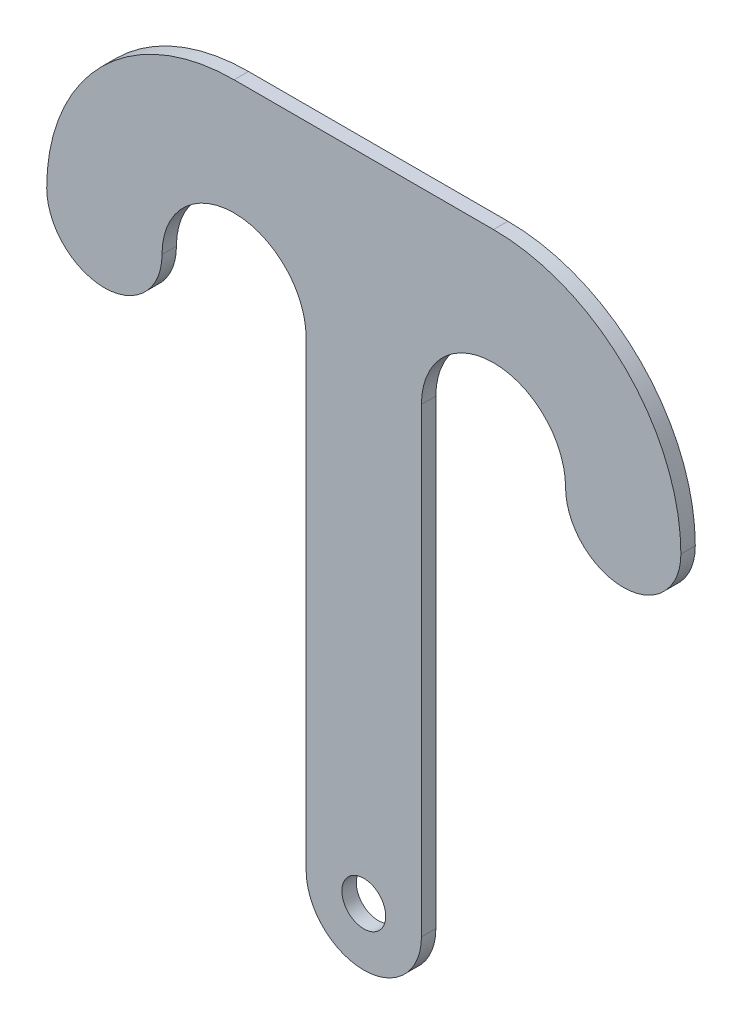
ISO-10303-21;
HEADER;
FILE_DESCRIPTION(('STEP AP214'),'2;1');
FILE_NAME('part.step','',(''),(''),'','','');
FILE_SCHEMA(('AUTOMOTIVE_DESIGN { 1 0 10303 214 1 1 1 1 }'));
ENDSEC;
DATA;
#1=APPLICATION_CONTEXT('core data for automotive mechanical design processes');
#2=APPLICATION_PROTOCOL_DEFINITION('international standard','automotive_design',2000,#1);
#3=PRODUCT_CONTEXT('',#1,'mechanical');
#4=PRODUCT('Part','Part','',(#3));
#5=PRODUCT_RELATED_PRODUCT_CATEGORY('part','',(#4));
#6=PRODUCT_DEFINITION_FORMATION('','',#4);
#7=PRODUCT_DEFINITION_CONTEXT('part definition',#1,'design');
#8=PRODUCT_DEFINITION('design','',#6,#7);
#9=PRODUCT_DEFINITION_SHAPE('','',#8);
#10=(LENGTH_UNIT() NAMED_UNIT(*) SI_UNIT(.MILLI.,.METRE.));
#11=(NAMED_UNIT(*) PLANE_ANGLE_UNIT() SI_UNIT($,.RADIAN.));
#12=(NAMED_UNIT(*) SI_UNIT($,.STERADIAN.) SOLID_ANGLE_UNIT());
#13=UNCERTAINTY_MEASURE_WITH_UNIT(LENGTH_MEASURE(1.E-05),#10,'distance_accuracy_value','');
#14=(GEOMETRIC_REPRESENTATION_CONTEXT(3) GLOBAL_UNCERTAINTY_ASSIGNED_CONTEXT((#13)) GLOBAL_UNIT_ASSIGNED_CONTEXT((#10,
#11,#12)) REPRESENTATION_CONTEXT('',''));
#15=CARTESIAN_POINT('',(0.,0.,0.));
#16=DIRECTION('',(0.,0.,1.));
#17=DIRECTION('',(1.,0.,0.));
#18=AXIS2_PLACEMENT_3D('',#15,#16,#17);
#19=CARTESIAN_POINT('',(0.,0.,3.175));
#20=DIRECTION('',(0.,0.,1.));
#21=DIRECTION('',(1.,0.,0.));
#22=AXIS2_PLACEMENT_3D('',#19,#20,#21);
#23=PLANE('',#22);
#24=CARTESIAN_POINT('',(0.,0.,3.175));
#25=DIRECTION('',(0.,0.,1.));
#26=DIRECTION('',(1.,0.,0.));
#27=AXIS2_PLACEMENT_3D('',#24,#25,#26);
#28=CIRCLE('',#27,12.7);
#29=CARTESIAN_POINT('',(-12.7,0.,3.175));
#30=VERTEX_POINT('',#29);
#31=CARTESIAN_POINT('',(12.7,0.,3.175));
#32=VERTEX_POINT('',#31);
#33=EDGE_CURVE('E165',#30,#32,#28,.T.);
#34=ORIENTED_EDGE('',*,*,#33,.T.);
#35=DIRECTION('',(0.,1.,0.));
#36=VECTOR('',#35,1.);
#37=CARTESIAN_POINT('',(12.7,0.,3.175));
#38=LINE('',#37,#36);
#39=CARTESIAN_POINT('',(12.7,101.6,3.175));
#40=VERTEX_POINT('',#39);
#41=EDGE_CURVE('E103',#32,#40,#38,.T.);
#42=ORIENTED_EDGE('',*,*,#41,.T.);
#43=CARTESIAN_POINT('',(28.575,101.6,3.175));
#44=DIRECTION('',(0.,0.,-1.));
#45=DIRECTION('',(-1.,0.,0.));
#46=AXIS2_PLACEMENT_3D('',#43,#44,#45);
#47=CIRCLE('',#46,15.875);
#48=CARTESIAN_POINT('',(44.45,101.6,3.175));
#49=VERTEX_POINT('',#48);
#50=EDGE_CURVE('E186',#40,#49,#47,.T.);
#51=ORIENTED_EDGE('',*,*,#50,.T.);
#52=CARTESIAN_POINT('',(57.15,101.6,3.175));
#53=DIRECTION('',(0.,0.,1.));
#54=DIRECTION('',(1.,0.,0.));
#55=AXIS2_PLACEMENT_3D('',#52,#53,#54);
#56=CIRCLE('',#55,12.7);
#57=CARTESIAN_POINT('',(69.85,101.6,3.175));
#58=VERTEX_POINT('',#57);
#59=EDGE_CURVE('E205',#49,#58,#56,.T.);
#60=ORIENTED_EDGE('',*,*,#59,.T.);
#61=CARTESIAN_POINT('',(28.575,101.6,3.175));
#62=DIRECTION('',(0.,0.,1.));
#63=DIRECTION('',(1.,0.,0.));
#64=AXIS2_PLACEMENT_3D('',#61,#62,#63);
#65=CIRCLE('',#64,41.275);
#66=CARTESIAN_POINT('',(28.575,142.875,3.175));
#67=VERTEX_POINT('',#66);
#68=EDGE_CURVE('E202',#58,#67,#65,.T.);
#69=ORIENTED_EDGE('',*,*,#68,.T.);
#70=DIRECTION('',(-1.,0.,0.));
#71=VECTOR('',#70,1.);
#72=CARTESIAN_POINT('',(28.575,142.875,3.175));
#73=LINE('',#72,#71);
#74=CARTESIAN_POINT('',(-28.575,142.875,3.175));
#75=VERTEX_POINT('',#74);
#76=EDGE_CURVE('E204',#67,#75,#73,.T.);
#77=ORIENTED_EDGE('',*,*,#76,.T.);
#78=CARTESIAN_POINT('',(-28.575,101.6,3.175));
#79=DIRECTION('',(0.,0.,1.));
#80=DIRECTION('',(-1.,0.,0.));
#81=AXIS2_PLACEMENT_3D('',#78,#79,#80);
#82=CIRCLE('',#81,41.275);
#83=CARTESIAN_POINT('',(-69.85,101.6,3.175));
#84=VERTEX_POINT('',#83);
#85=EDGE_CURVE('E128',#75,#84,#82,.T.);
#86=ORIENTED_EDGE('',*,*,#85,.T.);
#87=CARTESIAN_POINT('',(-57.15,101.6,3.175));
#88=DIRECTION('',(0.,0.,1.));
#89=DIRECTION('',(-1.,0.,0.));
#90=AXIS2_PLACEMENT_3D('',#87,#88,#89);
#91=CIRCLE('',#90,12.7);
#92=CARTESIAN_POINT('',(-44.45,101.6,3.175));
#93=VERTEX_POINT('',#92);
#94=EDGE_CURVE('E122',#84,#93,#91,.T.);
#95=ORIENTED_EDGE('',*,*,#94,.T.);
#96=CARTESIAN_POINT('',(-28.575,101.6,3.175));
#97=DIRECTION('',(0.,0.,-1.));
#98=DIRECTION('',(1.,0.,0.));
#99=AXIS2_PLACEMENT_3D('',#96,#97,#98);
#100=CIRCLE('',#99,15.875);
#101=CARTESIAN_POINT('',(-12.7,101.6,3.175));
#102=VERTEX_POINT('',#101);
#103=EDGE_CURVE('E126',#93,#102,#100,.T.);
#104=ORIENTED_EDGE('',*,*,#103,.T.);
#105=DIRECTION('',(0.,-1.,0.));
#106=VECTOR('',#105,1.);
#107=CARTESIAN_POINT('',(-12.7,0.,3.175));
#108=LINE('',#107,#106);
#109=EDGE_CURVE('E54',#102,#30,#108,.T.);
#110=ORIENTED_EDGE('',*,*,#109,.T.);
#111=EDGE_LOOP('',(#34,#42,#51,#60,#69,#77,#86,#95,#104,#110));
#112=FACE_BOUND('',#111,.T.);
#113=CARTESIAN_POINT('',(0.,0.,3.175));
#114=DIRECTION('',(0.,0.,1.));
#115=DIRECTION('',(1.,0.,0.));
#116=AXIS2_PLACEMENT_3D('',#113,#114,#115);
#117=CIRCLE('',#116,4.826);
#118=CARTESIAN_POINT('',(4.826,0.,3.175));
#119=VERTEX_POINT('',#118);
#120=EDGE_CURVE('E150',#119,#119,#117,.T.);
#121=ORIENTED_EDGE('',*,*,#120,.F.);
#122=EDGE_LOOP('',(#121));
#123=FACE_BOUND('',#122,.T.);
#124=ADVANCED_FACE('F37',(#112,#123),#23,.T.);
#125=CARTESIAN_POINT('',(0.,0.,0.));
#126=DIRECTION('',(0.,0.,1.));
#127=DIRECTION('',(1.,0.,0.));
#128=AXIS2_PLACEMENT_3D('',#125,#126,#127);
#129=PLANE('',#128);
#130=CARTESIAN_POINT('',(0.,0.,0.));
#131=DIRECTION('',(0.,0.,1.));
#132=DIRECTION('',(1.,0.,0.));
#133=AXIS2_PLACEMENT_3D('',#130,#131,#132);
#134=CIRCLE('',#133,12.7);
#135=CARTESIAN_POINT('',(-12.7,0.,0.));
#136=VERTEX_POINT('',#135);
#137=CARTESIAN_POINT('',(12.7,0.,0.));
#138=VERTEX_POINT('',#137);
#139=EDGE_CURVE('E146',#136,#138,#134,.T.);
#140=ORIENTED_EDGE('',*,*,#139,.F.);
#141=DIRECTION('',(0.,-1.,0.));
#142=VECTOR('',#141,1.);
#143=CARTESIAN_POINT('',(-12.7,0.,0.));
#144=LINE('',#143,#142);
#145=CARTESIAN_POINT('',(-12.7,101.6,0.));
#146=VERTEX_POINT('',#145);
#147=EDGE_CURVE('E95',#146,#136,#144,.T.);
#148=ORIENTED_EDGE('',*,*,#147,.F.);
#149=CARTESIAN_POINT('',(-28.575,101.6,0.));
#150=DIRECTION('',(0.,0.,-1.));
#151=DIRECTION('',(1.,0.,0.));
#152=AXIS2_PLACEMENT_3D('',#149,#150,#151);
#153=CIRCLE('',#152,15.875);
#154=CARTESIAN_POINT('',(-44.45,101.6,0.));
#155=VERTEX_POINT('',#154);
#156=EDGE_CURVE('E89',#155,#146,#153,.T.);
#157=ORIENTED_EDGE('',*,*,#156,.F.);
#158=CARTESIAN_POINT('',(-57.15,101.6,0.));
#159=DIRECTION('',(0.,0.,1.));
#160=DIRECTION('',(-1.,0.,0.));
#161=AXIS2_PLACEMENT_3D('',#158,#159,#160);
#162=CIRCLE('',#161,12.7);
#163=CARTESIAN_POINT('',(-69.85,101.6,0.));
#164=VERTEX_POINT('',#163);
#165=EDGE_CURVE('E136',#164,#155,#162,.T.);
#166=ORIENTED_EDGE('',*,*,#165,.F.);
#167=CARTESIAN_POINT('',(-28.575,101.6,0.));
#168=DIRECTION('',(0.,0.,1.));
#169=DIRECTION('',(-1.,0.,0.));
#170=AXIS2_PLACEMENT_3D('',#167,#168,#169);
#171=CIRCLE('',#170,41.275);
#172=CARTESIAN_POINT('',(-28.575,142.875,0.));
#173=VERTEX_POINT('',#172);
#174=EDGE_CURVE('E160',#173,#164,#171,.T.);
#175=ORIENTED_EDGE('',*,*,#174,.F.);
#176=DIRECTION('',(-1.,0.,0.));
#177=VECTOR('',#176,1.);
#178=CARTESIAN_POINT('',(28.575,142.875,0.));
#179=LINE('',#178,#177);
#180=CARTESIAN_POINT('',(28.575,142.875,0.));
#181=VERTEX_POINT('',#180);
#182=EDGE_CURVE('E158',#181,#173,#179,.T.);
#183=ORIENTED_EDGE('',*,*,#182,.F.);
#184=CARTESIAN_POINT('',(28.575,101.6,0.));
#185=DIRECTION('',(0.,0.,1.));
#186=DIRECTION('',(1.,0.,0.));
#187=AXIS2_PLACEMENT_3D('',#184,#185,#186);
#188=CIRCLE('',#187,41.275);
#189=CARTESIAN_POINT('',(69.85,101.6,0.));
#190=VERTEX_POINT('',#189);
#191=EDGE_CURVE('E156',#190,#181,#188,.T.);
#192=ORIENTED_EDGE('',*,*,#191,.F.);
#193=CARTESIAN_POINT('',(57.15,101.6,0.));
#194=DIRECTION('',(0.,0.,1.));
#195=DIRECTION('',(1.,0.,0.));
#196=AXIS2_PLACEMENT_3D('',#193,#194,#195);
#197=CIRCLE('',#196,12.7);
#198=CARTESIAN_POINT('',(44.45,101.6,0.));
#199=VERTEX_POINT('',#198);
#200=EDGE_CURVE('E154',#199,#190,#197,.T.);
#201=ORIENTED_EDGE('',*,*,#200,.F.);
#202=CARTESIAN_POINT('',(28.575,101.6,0.));
#203=DIRECTION('',(0.,0.,-1.));
#204=DIRECTION('',(-1.,0.,0.));
#205=AXIS2_PLACEMENT_3D('',#202,#203,#204);
#206=CIRCLE('',#205,15.875);
#207=CARTESIAN_POINT('',(12.7,101.6,0.));
#208=VERTEX_POINT('',#207);
#209=EDGE_CURVE('E152',#208,#199,#206,.T.);
#210=ORIENTED_EDGE('',*,*,#209,.F.);
#211=DIRECTION('',(0.,1.,0.));
#212=VECTOR('',#211,1.);
#213=CARTESIAN_POINT('',(12.7,0.,0.));
#214=LINE('',#213,#212);
#215=EDGE_CURVE('E149',#138,#208,#214,.T.);
#216=ORIENTED_EDGE('',*,*,#215,.F.);
#217=EDGE_LOOP('',(#140,#148,#157,#166,#175,#183,#192,#201,#210,#216));
#218=FACE_BOUND('',#217,.T.);
#219=CARTESIAN_POINT('',(0.,0.,0.));
#220=DIRECTION('',(0.,0.,1.));
#221=DIRECTION('',(1.,0.,0.));
#222=AXIS2_PLACEMENT_3D('',#219,#220,#221);
#223=CIRCLE('',#222,4.826);
#224=CARTESIAN_POINT('',(4.826,0.,0.));
#225=VERTEX_POINT('',#224);
#226=EDGE_CURVE('E213',#225,#225,#223,.T.);
#227=ORIENTED_EDGE('',*,*,#226,.T.);
#228=EDGE_LOOP('',(#227));
#229=FACE_BOUND('',#228,.T.);
#230=ADVANCED_FACE('F190',(#218,#229),#129,.F.);
#231=CARTESIAN_POINT('',(0.,0.,3.175));
#232=DIRECTION('',(0.,0.,-1.));
#233=DIRECTION('',(-1.,0.,0.));
#234=AXIS2_PLACEMENT_3D('',#231,#232,#233);
#235=CYLINDRICAL_SURFACE('',#234,12.7);
#236=ORIENTED_EDGE('',*,*,#139,.T.);
#237=DIRECTION('',(0.,0.,-1.));
#238=VECTOR('',#237,1.);
#239=CARTESIAN_POINT('',(12.7,0.,3.175));
#240=LINE('',#239,#238);
#241=EDGE_CURVE('E11',#32,#138,#240,.T.);
#242=ORIENTED_EDGE('',*,*,#241,.F.);
#243=ORIENTED_EDGE('',*,*,#33,.F.);
#244=DIRECTION('',(0.,0.,-1.));
#245=VECTOR('',#244,1.);
#246=CARTESIAN_POINT('',(-12.7,0.,3.175));
#247=LINE('',#246,#245);
#248=EDGE_CURVE('E142',#30,#136,#247,.T.);
#249=ORIENTED_EDGE('',*,*,#248,.T.);
#250=EDGE_LOOP('',(#236,#242,#243,#249));
#251=FACE_BOUND('',#250,.T.);
#252=ADVANCED_FACE('F39',(#251),#235,.T.);
#253=CARTESIAN_POINT('',(12.7,0.,3.175));
#254=DIRECTION('',(-1.,0.,0.));
#255=DIRECTION('',(0.,0.,1.));
#256=AXIS2_PLACEMENT_3D('',#253,#254,#255);
#257=PLANE('',#256);
#258=ORIENTED_EDGE('',*,*,#215,.T.);
#259=DIRECTION('',(0.,0.,-1.));
#260=VECTOR('',#259,1.);
#261=CARTESIAN_POINT('',(12.7,101.6,3.175));
#262=LINE('',#261,#260);
#263=EDGE_CURVE('E46',#40,#208,#262,.T.);
#264=ORIENTED_EDGE('',*,*,#263,.F.);
#265=ORIENTED_EDGE('',*,*,#41,.F.);
#266=ORIENTED_EDGE('',*,*,#241,.T.);
#267=EDGE_LOOP('',(#258,#264,#265,#266));
#268=FACE_BOUND('',#267,.T.);
#269=ADVANCED_FACE('F249',(#268),#257,.F.);
#270=CARTESIAN_POINT('',(28.575,101.6,3.175));
#271=DIRECTION('',(0.,0.,-1.));
#272=DIRECTION('',(-1.,0.,0.));
#273=AXIS2_PLACEMENT_3D('',#270,#271,#272);
#274=CYLINDRICAL_SURFACE('',#273,15.875);
#275=ORIENTED_EDGE('',*,*,#209,.T.);
#276=DIRECTION('',(0.,0.,-1.));
#277=VECTOR('',#276,1.);
#278=CARTESIAN_POINT('',(44.45,101.6,3.175));
#279=LINE('',#278,#277);
#280=EDGE_CURVE('E178',#49,#199,#279,.T.);
#281=ORIENTED_EDGE('',*,*,#280,.F.);
#282=ORIENTED_EDGE('',*,*,#50,.F.);
#283=ORIENTED_EDGE('',*,*,#263,.T.);
#284=EDGE_LOOP('',(#275,#281,#282,#283));
#285=FACE_BOUND('',#284,.T.);
#286=ADVANCED_FACE('F184',(#285),#274,.F.);
#287=CARTESIAN_POINT('',(57.15,101.6,3.175));
#288=DIRECTION('',(0.,0.,-1.));
#289=DIRECTION('',(-1.,0.,0.));
#290=AXIS2_PLACEMENT_3D('',#287,#288,#289);
#291=CYLINDRICAL_SURFACE('',#290,12.7);
#292=ORIENTED_EDGE('',*,*,#200,.T.);
#293=DIRECTION('',(0.,0.,-1.));
#294=VECTOR('',#293,1.);
#295=CARTESIAN_POINT('',(69.85,101.6,3.175));
#296=LINE('',#295,#294);
#297=EDGE_CURVE('E175',#58,#190,#296,.T.);
#298=ORIENTED_EDGE('',*,*,#297,.F.);
#299=ORIENTED_EDGE('',*,*,#59,.F.);
#300=ORIENTED_EDGE('',*,*,#280,.T.);
#301=EDGE_LOOP('',(#292,#298,#299,#300));
#302=FACE_BOUND('',#301,.T.);
#303=ADVANCED_FACE('F196',(#302),#291,.T.);
#304=CARTESIAN_POINT('',(28.575,101.6,3.175));
#305=DIRECTION('',(0.,0.,-1.));
#306=DIRECTION('',(-1.,0.,0.));
#307=AXIS2_PLACEMENT_3D('',#304,#305,#306);
#308=CYLINDRICAL_SURFACE('',#307,41.275);
#309=ORIENTED_EDGE('',*,*,#191,.T.);
#310=DIRECTION('',(0.,0.,-1.));
#311=VECTOR('',#310,1.);
#312=CARTESIAN_POINT('',(28.575,142.875,3.175));
#313=LINE('',#312,#311);
#314=EDGE_CURVE('E172',#67,#181,#313,.T.);
#315=ORIENTED_EDGE('',*,*,#314,.F.);
#316=ORIENTED_EDGE('',*,*,#68,.F.);
#317=ORIENTED_EDGE('',*,*,#297,.T.);
#318=EDGE_LOOP('',(#309,#315,#316,#317));
#319=FACE_BOUND('',#318,.T.);
#320=ADVANCED_FACE('F200',(#319),#308,.T.);
#321=CARTESIAN_POINT('',(28.575,142.875,3.175));
#322=DIRECTION('',(0.,-1.,0.));
#323=DIRECTION('',(0.,0.,-1.));
#324=AXIS2_PLACEMENT_3D('',#321,#322,#323);
#325=PLANE('',#324);
#326=ORIENTED_EDGE('',*,*,#182,.T.);
#327=DIRECTION('',(0.,0.,-1.));
#328=VECTOR('',#327,1.);
#329=CARTESIAN_POINT('',(-28.575,142.875,3.175));
#330=LINE('',#329,#328);
#331=EDGE_CURVE('E169',#75,#173,#330,.T.);
#332=ORIENTED_EDGE('',*,*,#331,.F.);
#333=ORIENTED_EDGE('',*,*,#76,.F.);
#334=ORIENTED_EDGE('',*,*,#314,.T.);
#335=EDGE_LOOP('',(#326,#332,#333,#334));
#336=FACE_BOUND('',#335,.T.);
#337=ADVANCED_FACE('F239',(#336),#325,.F.);
#338=CARTESIAN_POINT('',(-28.575,101.6,3.175));
#339=DIRECTION('',(0.,0.,-1.));
#340=DIRECTION('',(-1.,0.,0.));
#341=AXIS2_PLACEMENT_3D('',#338,#339,#340);
#342=CYLINDRICAL_SURFACE('',#341,41.275);
#343=ORIENTED_EDGE('',*,*,#174,.T.);
#344=DIRECTION('',(0.,0.,-1.));
#345=VECTOR('',#344,1.);
#346=CARTESIAN_POINT('',(-69.85,101.6,3.175));
#347=LINE('',#346,#345);
#348=EDGE_CURVE('E137',#84,#164,#347,.T.);
#349=ORIENTED_EDGE('',*,*,#348,.F.);
#350=ORIENTED_EDGE('',*,*,#85,.F.);
#351=ORIENTED_EDGE('',*,*,#331,.T.);
#352=EDGE_LOOP('',(#343,#349,#350,#351));
#353=FACE_BOUND('',#352,.T.);
#354=ADVANCED_FACE('F236',(#353),#342,.T.);
#355=CARTESIAN_POINT('',(-57.15,101.6,3.175));
#356=DIRECTION('',(0.,0.,-1.));
#357=DIRECTION('',(-1.,0.,0.));
#358=AXIS2_PLACEMENT_3D('',#355,#356,#357);
#359=CYLINDRICAL_SURFACE('',#358,12.7);
#360=ORIENTED_EDGE('',*,*,#165,.T.);
#361=DIRECTION('',(0.,0.,-1.));
#362=VECTOR('',#361,1.);
#363=CARTESIAN_POINT('',(-44.45,101.6,3.175));
#364=LINE('',#363,#362);
#365=EDGE_CURVE('E133',#93,#155,#364,.T.);
#366=ORIENTED_EDGE('',*,*,#365,.F.);
#367=ORIENTED_EDGE('',*,*,#94,.F.);
#368=ORIENTED_EDGE('',*,*,#348,.T.);
#369=EDGE_LOOP('',(#360,#366,#367,#368));
#370=FACE_BOUND('',#369,.T.);
#371=ADVANCED_FACE('F134',(#370),#359,.T.);
#372=CARTESIAN_POINT('',(-28.575,101.6,3.175));
#373=DIRECTION('',(0.,0.,-1.));
#374=DIRECTION('',(-1.,0.,0.));
#375=AXIS2_PLACEMENT_3D('',#372,#373,#374);
#376=CYLINDRICAL_SURFACE('',#375,15.875);
#377=ORIENTED_EDGE('',*,*,#156,.T.);
#378=DIRECTION('',(0.,0.,-1.));
#379=VECTOR('',#378,1.);
#380=CARTESIAN_POINT('',(-12.7,101.6,3.175));
#381=LINE('',#380,#379);
#382=EDGE_CURVE('E138',#102,#146,#381,.T.);
#383=ORIENTED_EDGE('',*,*,#382,.F.);
#384=ORIENTED_EDGE('',*,*,#103,.F.);
#385=ORIENTED_EDGE('',*,*,#365,.T.);
#386=EDGE_LOOP('',(#377,#383,#384,#385));
#387=FACE_BOUND('',#386,.T.);
#388=ADVANCED_FACE('F140',(#387),#376,.F.);
#389=CARTESIAN_POINT('',(-12.7,0.,3.175));
#390=DIRECTION('',(1.,0.,0.));
#391=DIRECTION('',(0.,0.,-1.));
#392=AXIS2_PLACEMENT_3D('',#389,#390,#391);
#393=PLANE('',#392);
#394=ORIENTED_EDGE('',*,*,#147,.T.);
#395=ORIENTED_EDGE('',*,*,#248,.F.);
#396=ORIENTED_EDGE('',*,*,#109,.F.);
#397=ORIENTED_EDGE('',*,*,#382,.T.);
#398=EDGE_LOOP('',(#394,#395,#396,#397));
#399=FACE_BOUND('',#398,.T.);
#400=ADVANCED_FACE('F229',(#399),#393,.F.);
#401=CARTESIAN_POINT('',(0.,0.,3.175));
#402=DIRECTION('',(0.,0.,-1.));
#403=DIRECTION('',(-1.,0.,0.));
#404=AXIS2_PLACEMENT_3D('',#401,#402,#403);
#405=CYLINDRICAL_SURFACE('',#404,4.826);
#406=ORIENTED_EDGE('',*,*,#120,.T.);
#407=EDGE_LOOP('',(#406));
#408=FACE_BOUND('',#407,.T.);
#409=ORIENTED_EDGE('',*,*,#226,.F.);
#410=EDGE_LOOP('',(#409));
#411=FACE_BOUND('',#410,.T.);
#412=ADVANCED_FACE('F219',(#408,#411),#405,.F.);
#413=CLOSED_SHELL('',(#124,#230,#252,#269,#286,#303,#320,#337,#354,#371,#388,#400,#412));
#414=MANIFOLD_SOLID_BREP('B2',#413);
#415=ADVANCED_BREP_SHAPE_REPRESENTATION('',(#18,#414),#14);
#416=SHAPE_DEFINITION_REPRESENTATION(#9,#415);
ENDSEC;
END-ISO-10303-21;
